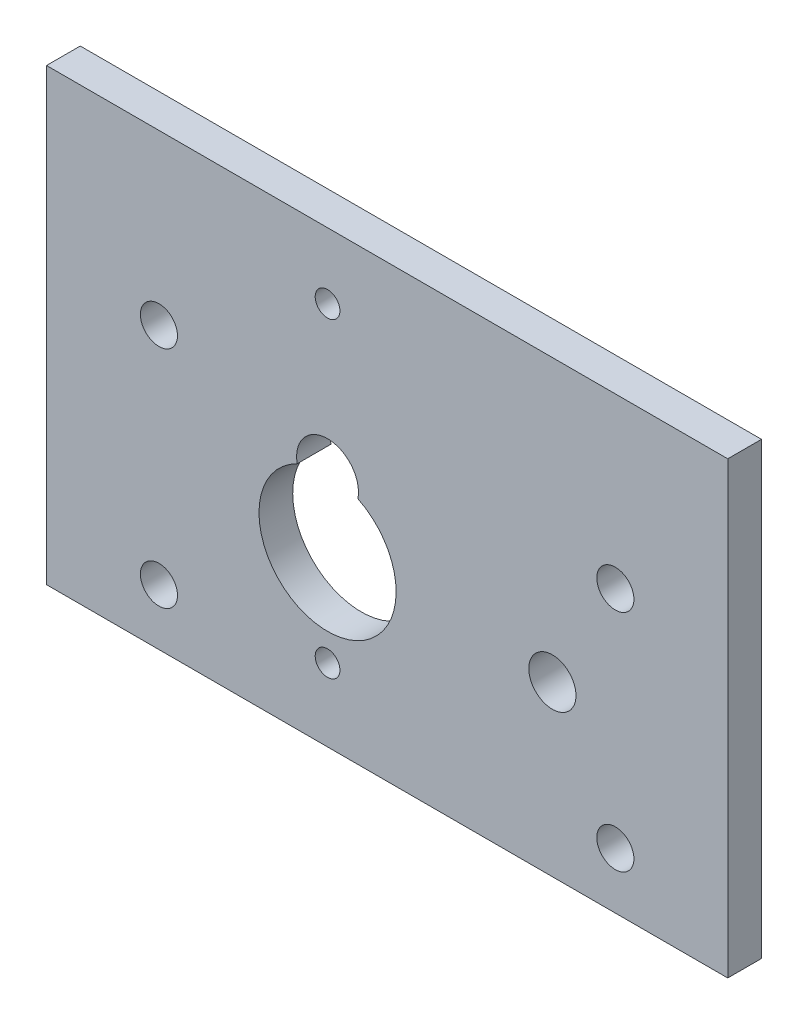
ISO-10303-21;
HEADER;
FILE_DESCRIPTION(('STEP AP214'),'2;1');
FILE_NAME('part.step','',(''),(''),'','','');
FILE_SCHEMA(('AUTOMOTIVE_DESIGN { 1 0 10303 214 1 1 1 1 }'));
ENDSEC;
DATA;
#1=APPLICATION_CONTEXT('core data for automotive mechanical design processes');
#2=APPLICATION_PROTOCOL_DEFINITION('international standard','automotive_design',2000,#1);
#3=PRODUCT_CONTEXT('',#1,'mechanical');
#4=PRODUCT('Part','Part','',(#3));
#5=PRODUCT_RELATED_PRODUCT_CATEGORY('part','',(#4));
#6=PRODUCT_DEFINITION_FORMATION('','',#4);
#7=PRODUCT_DEFINITION_CONTEXT('part definition',#1,'design');
#8=PRODUCT_DEFINITION('design','',#6,#7);
#9=PRODUCT_DEFINITION_SHAPE('','',#8);
#10=(LENGTH_UNIT() NAMED_UNIT(*) SI_UNIT(.MILLI.,.METRE.));
#11=(NAMED_UNIT(*) PLANE_ANGLE_UNIT() SI_UNIT($,.RADIAN.));
#12=(NAMED_UNIT(*) SI_UNIT($,.STERADIAN.) SOLID_ANGLE_UNIT());
#13=UNCERTAINTY_MEASURE_WITH_UNIT(LENGTH_MEASURE(1.E-05),#10,'distance_accuracy_value','');
#14=(GEOMETRIC_REPRESENTATION_CONTEXT(3) GLOBAL_UNCERTAINTY_ASSIGNED_CONTEXT((#13)) GLOBAL_UNIT_ASSIGNED_CONTEXT((#10,
#11,#12)) REPRESENTATION_CONTEXT('',''));
#15=CARTESIAN_POINT('',(0.,0.,0.));
#16=DIRECTION('',(0.,0.,1.));
#17=DIRECTION('',(1.,0.,0.));
#18=AXIS2_PLACEMENT_3D('',#15,#16,#17);
#19=CARTESIAN_POINT('',(0.,0.,3.));
#20=DIRECTION('',(1.,0.,0.));
#21=DIRECTION('',(0.,0.,-1.));
#22=AXIS2_PLACEMENT_3D('',#19,#20,#21);
#23=PLANE('',#22);
#24=DIRECTION('',(0.,-1.,0.));
#25=VECTOR('',#24,1.);
#26=CARTESIAN_POINT('',(0.,0.,0.));
#27=LINE('',#26,#25);
#28=CARTESIAN_POINT('',(0.,40.,0.));
#29=VERTEX_POINT('',#28);
#30=CARTESIAN_POINT('',(0.,0.,0.));
#31=VERTEX_POINT('',#30);
#32=EDGE_CURVE('E113',#29,#31,#27,.T.);
#33=ORIENTED_EDGE('',*,*,#32,.T.);
#34=DIRECTION('',(0.,0.,-1.));
#35=VECTOR('',#34,1.);
#36=CARTESIAN_POINT('',(0.,0.,3.));
#37=LINE('',#36,#35);
#38=CARTESIAN_POINT('',(0.,0.,3.));
#39=VERTEX_POINT('',#38);
#40=EDGE_CURVE('E11',#39,#31,#37,.T.);
#41=ORIENTED_EDGE('',*,*,#40,.F.);
#42=DIRECTION('',(0.,-1.,0.));
#43=VECTOR('',#42,1.);
#44=CARTESIAN_POINT('',(0.,0.,3.));
#45=LINE('',#44,#43);
#46=CARTESIAN_POINT('',(0.,40.,3.));
#47=VERTEX_POINT('',#46);
#48=EDGE_CURVE('E115',#47,#39,#45,.T.);
#49=ORIENTED_EDGE('',*,*,#48,.F.);
#50=DIRECTION('',(0.,0.,-1.));
#51=VECTOR('',#50,1.);
#52=CARTESIAN_POINT('',(0.,40.,3.));
#53=LINE('',#52,#51);
#54=EDGE_CURVE('E125',#47,#29,#53,.T.);
#55=ORIENTED_EDGE('',*,*,#54,.T.);
#56=EDGE_LOOP('',(#33,#41,#49,#55));
#57=FACE_BOUND('',#56,.T.);
#58=ADVANCED_FACE('F39',(#57),#23,.F.);
#59=CARTESIAN_POINT('',(0.,0.,3.));
#60=DIRECTION('',(0.,1.,0.));
#61=DIRECTION('',(0.,0.,1.));
#62=AXIS2_PLACEMENT_3D('',#59,#60,#61);
#63=PLANE('',#62);
#64=DIRECTION('',(1.,0.,0.));
#65=VECTOR('',#64,1.);
#66=CARTESIAN_POINT('',(0.,0.,0.));
#67=LINE('',#66,#65);
#68=CARTESIAN_POINT('',(60.6,0.,0.));
#69=VERTEX_POINT('',#68);
#70=EDGE_CURVE('E128',#31,#69,#67,.T.);
#71=ORIENTED_EDGE('',*,*,#70,.T.);
#72=DIRECTION('',(0.,0.,-1.));
#73=VECTOR('',#72,1.);
#74=CARTESIAN_POINT('',(60.6,0.,3.));
#75=LINE('',#74,#73);
#76=CARTESIAN_POINT('',(60.6,0.,3.));
#77=VERTEX_POINT('',#76);
#78=EDGE_CURVE('E47',#77,#69,#75,.T.);
#79=ORIENTED_EDGE('',*,*,#78,.F.);
#80=DIRECTION('',(1.,0.,0.));
#81=VECTOR('',#80,1.);
#82=CARTESIAN_POINT('',(0.,0.,3.));
#83=LINE('',#82,#81);
#84=EDGE_CURVE('E118',#39,#77,#83,.T.);
#85=ORIENTED_EDGE('',*,*,#84,.F.);
#86=ORIENTED_EDGE('',*,*,#40,.T.);
#87=EDGE_LOOP('',(#71,#79,#85,#86));
#88=FACE_BOUND('',#87,.T.);
#89=ADVANCED_FACE('F225',(#88),#63,.F.);
#90=CARTESIAN_POINT('',(60.6,0.,3.));
#91=DIRECTION('',(-1.,0.,0.));
#92=DIRECTION('',(0.,0.,1.));
#93=AXIS2_PLACEMENT_3D('',#90,#91,#92);
#94=PLANE('',#93);
#95=DIRECTION('',(0.,1.,0.));
#96=VECTOR('',#95,1.);
#97=CARTESIAN_POINT('',(60.6,0.,0.));
#98=LINE('',#97,#96);
#99=CARTESIAN_POINT('',(60.6,40.,0.));
#100=VERTEX_POINT('',#99);
#101=EDGE_CURVE('E130',#69,#100,#98,.T.);
#102=ORIENTED_EDGE('',*,*,#101,.T.);
#103=DIRECTION('',(0.,0.,-1.));
#104=VECTOR('',#103,1.);
#105=CARTESIAN_POINT('',(60.6,40.,3.));
#106=LINE('',#105,#104);
#107=CARTESIAN_POINT('',(60.6,40.,3.));
#108=VERTEX_POINT('',#107);
#109=EDGE_CURVE('E135',#108,#100,#106,.T.);
#110=ORIENTED_EDGE('',*,*,#109,.F.);
#111=DIRECTION('',(0.,1.,0.));
#112=VECTOR('',#111,1.);
#113=CARTESIAN_POINT('',(60.6,0.,3.));
#114=LINE('',#113,#112);
#115=EDGE_CURVE('E121',#77,#108,#114,.T.);
#116=ORIENTED_EDGE('',*,*,#115,.F.);
#117=ORIENTED_EDGE('',*,*,#78,.T.);
#118=EDGE_LOOP('',(#102,#110,#116,#117));
#119=FACE_BOUND('',#118,.T.);
#120=ADVANCED_FACE('F222',(#119),#94,.F.);
#121=CARTESIAN_POINT('',(0.,40.,3.));
#122=DIRECTION('',(0.,-1.,0.));
#123=DIRECTION('',(0.,0.,-1.));
#124=AXIS2_PLACEMENT_3D('',#121,#122,#123);
#125=PLANE('',#124);
#126=DIRECTION('',(-1.,0.,0.));
#127=VECTOR('',#126,1.);
#128=CARTESIAN_POINT('',(0.,40.,0.));
#129=LINE('',#128,#127);
#130=EDGE_CURVE('E119',#100,#29,#129,.T.);
#131=ORIENTED_EDGE('',*,*,#130,.T.);
#132=ORIENTED_EDGE('',*,*,#54,.F.);
#133=DIRECTION('',(-1.,0.,0.));
#134=VECTOR('',#133,1.);
#135=CARTESIAN_POINT('',(0.,40.,3.));
#136=LINE('',#135,#134);
#137=EDGE_CURVE('E123',#108,#47,#136,.T.);
#138=ORIENTED_EDGE('',*,*,#137,.F.);
#139=ORIENTED_EDGE('',*,*,#109,.T.);
#140=EDGE_LOOP('',(#131,#132,#138,#139));
#141=FACE_BOUND('',#140,.T.);
#142=ADVANCED_FACE('F189',(#141),#125,.F.);
#143=CARTESIAN_POINT('',(0.,0.,3.));
#144=DIRECTION('',(0.,0.,-1.));
#145=DIRECTION('',(-1.,0.,0.));
#146=AXIS2_PLACEMENT_3D('',#143,#144,#145);
#147=PLANE('',#146);
#148=CARTESIAN_POINT('',(10.,5.,3.));
#149=DIRECTION('',(0.,0.,1.));
#150=DIRECTION('',(1.,0.,0.));
#151=AXIS2_PLACEMENT_3D('',#148,#149,#150);
#152=CIRCLE('',#151,1.65);
#153=CARTESIAN_POINT('',(11.65,5.,3.));
#154=VERTEX_POINT('',#153);
#155=EDGE_CURVE('E175',#154,#154,#152,.T.);
#156=ORIENTED_EDGE('',*,*,#155,.F.);
#157=EDGE_LOOP('',(#156));
#158=FACE_BOUND('',#157,.T.);
#159=CARTESIAN_POINT('',(10.,25.,3.));
#160=DIRECTION('',(0.,0.,1.));
#161=DIRECTION('',(1.,0.,0.));
#162=AXIS2_PLACEMENT_3D('',#159,#160,#161);
#163=CIRCLE('',#162,1.65);
#164=CARTESIAN_POINT('',(11.65,25.,3.));
#165=VERTEX_POINT('',#164);
#166=EDGE_CURVE('E178',#165,#165,#163,.T.);
#167=ORIENTED_EDGE('',*,*,#166,.F.);
#168=EDGE_LOOP('',(#167));
#169=FACE_BOUND('',#168,.T.);
#170=CARTESIAN_POINT('',(50.6,25.,3.));
#171=DIRECTION('',(0.,0.,1.));
#172=DIRECTION('',(1.,0.,0.));
#173=AXIS2_PLACEMENT_3D('',#170,#171,#172);
#174=CIRCLE('',#173,1.65);
#175=CARTESIAN_POINT('',(52.25,25.,3.));
#176=VERTEX_POINT('',#175);
#177=EDGE_CURVE('E174',#176,#176,#174,.T.);
#178=ORIENTED_EDGE('',*,*,#177,.F.);
#179=EDGE_LOOP('',(#178));
#180=FACE_BOUND('',#179,.T.);
#181=CARTESIAN_POINT('',(50.6,5.,3.));
#182=DIRECTION('',(0.,0.,1.));
#183=DIRECTION('',(1.,0.,0.));
#184=AXIS2_PLACEMENT_3D('',#181,#182,#183);
#185=CIRCLE('',#184,1.65);
#186=CARTESIAN_POINT('',(52.25,5.,3.));
#187=VERTEX_POINT('',#186);
#188=EDGE_CURVE('E144',#187,#187,#185,.T.);
#189=ORIENTED_EDGE('',*,*,#188,.F.);
#190=EDGE_LOOP('',(#189));
#191=FACE_BOUND('',#190,.T.);
#192=CARTESIAN_POINT('',(45.,15.,3.));
#193=DIRECTION('',(0.,0.,-1.));
#194=DIRECTION('',(-1.,0.,0.));
#195=AXIS2_PLACEMENT_3D('',#192,#193,#194);
#196=CIRCLE('',#195,2.1);
#197=CARTESIAN_POINT('',(42.9,15.,3.));
#198=VERTEX_POINT('',#197);
#199=EDGE_CURVE('E108',#198,#198,#196,.T.);
#200=ORIENTED_EDGE('',*,*,#199,.T.);
#201=EDGE_LOOP('',(#200));
#202=FACE_BOUND('',#201,.T.);
#203=CARTESIAN_POINT('',(25.,34.14,3.));
#204=DIRECTION('',(0.,0.,-1.));
#205=DIRECTION('',(-1.,0.,0.));
#206=AXIS2_PLACEMENT_3D('',#203,#204,#205);
#207=CIRCLE('',#206,1.09999999999999);
#208=CARTESIAN_POINT('',(23.9,34.14,3.));
#209=VERTEX_POINT('',#208);
#210=EDGE_CURVE('E158',#209,#209,#207,.T.);
#211=ORIENTED_EDGE('',*,*,#210,.T.);
#212=EDGE_LOOP('',(#211));
#213=FACE_BOUND('',#212,.T.);
#214=CARTESIAN_POINT('',(25.,6.46,3.));
#215=DIRECTION('',(0.,0.,-1.));
#216=DIRECTION('',(-1.,0.,0.));
#217=AXIS2_PLACEMENT_3D('',#214,#215,#216);
#218=CIRCLE('',#217,1.1);
#219=CARTESIAN_POINT('',(23.9,6.46,3.));
#220=VERTEX_POINT('',#219);
#221=EDGE_CURVE('E167',#220,#220,#218,.T.);
#222=ORIENTED_EDGE('',*,*,#221,.T.);
#223=EDGE_LOOP('',(#222));
#224=FACE_BOUND('',#223,.T.);
#225=CARTESIAN_POINT('',(25.,21.,3.));
#226=DIRECTION('',(0.,0.,-1.));
#227=DIRECTION('',(-1.,0.,0.));
#228=AXIS2_PLACEMENT_3D('',#225,#226,#227);
#229=CIRCLE('',#228,2.75);
#230=CARTESIAN_POINT('',(22.3014333231556,20.470625,3.));
#231=VERTEX_POINT('',#230);
#232=CARTESIAN_POINT('',(27.6985666768444,20.470625,3.));
#233=VERTEX_POINT('',#232);
#234=EDGE_CURVE('E96',#231,#233,#229,.T.);
#235=ORIENTED_EDGE('',*,*,#234,.T.);
#236=CARTESIAN_POINT('',(25.,15.,3.));
#237=DIRECTION('',(0.,0.,-1.));
#238=DIRECTION('',(-1.,0.,0.));
#239=AXIS2_PLACEMENT_3D('',#236,#237,#238);
#240=CIRCLE('',#239,6.1);
#241=EDGE_CURVE('E55',#233,#231,#240,.T.);
#242=ORIENTED_EDGE('',*,*,#241,.T.);
#243=EDGE_LOOP('',(#235,#242));
#244=FACE_BOUND('',#243,.T.);
#245=ORIENTED_EDGE('',*,*,#48,.T.);
#246=ORIENTED_EDGE('',*,*,#84,.T.);
#247=ORIENTED_EDGE('',*,*,#115,.T.);
#248=ORIENTED_EDGE('',*,*,#137,.T.);
#249=EDGE_LOOP('',(#245,#246,#247,#248));
#250=FACE_BOUND('',#249,.T.);
#251=ADVANCED_FACE('F102',(#158,#169,#180,#191,#202,#213,#224,#244,#250),#147,.F.);
#252=CARTESIAN_POINT('',(0.,0.,0.));
#253=DIRECTION('',(0.,0.,-1.));
#254=DIRECTION('',(-1.,0.,0.));
#255=AXIS2_PLACEMENT_3D('',#252,#253,#254);
#256=PLANE('',#255);
#257=CARTESIAN_POINT('',(10.,5.,0.));
#258=DIRECTION('',(0.,0.,-1.));
#259=DIRECTION('',(-1.,0.,0.));
#260=AXIS2_PLACEMENT_3D('',#257,#258,#259);
#261=CIRCLE('',#260,1.65);
#262=CARTESIAN_POINT('',(11.65,5.,0.));
#263=VERTEX_POINT('',#262);
#264=EDGE_CURVE('E42',#263,#263,#261,.T.);
#265=ORIENTED_EDGE('',*,*,#264,.F.);
#266=EDGE_LOOP('',(#265));
#267=FACE_BOUND('',#266,.T.);
#268=CARTESIAN_POINT('',(10.,25.,0.));
#269=DIRECTION('',(0.,0.,-1.));
#270=DIRECTION('',(-1.,0.,0.));
#271=AXIS2_PLACEMENT_3D('',#268,#269,#270);
#272=CIRCLE('',#271,1.65);
#273=CARTESIAN_POINT('',(11.65,25.,0.));
#274=VERTEX_POINT('',#273);
#275=EDGE_CURVE('E146',#274,#274,#272,.T.);
#276=ORIENTED_EDGE('',*,*,#275,.F.);
#277=EDGE_LOOP('',(#276));
#278=FACE_BOUND('',#277,.T.);
#279=CARTESIAN_POINT('',(50.6,25.,0.));
#280=DIRECTION('',(0.,0.,-1.));
#281=DIRECTION('',(-1.,0.,0.));
#282=AXIS2_PLACEMENT_3D('',#279,#280,#281);
#283=CIRCLE('',#282,1.65);
#284=CARTESIAN_POINT('',(52.25,25.,0.));
#285=VERTEX_POINT('',#284);
#286=EDGE_CURVE('E143',#285,#285,#283,.T.);
#287=ORIENTED_EDGE('',*,*,#286,.F.);
#288=EDGE_LOOP('',(#287));
#289=FACE_BOUND('',#288,.T.);
#290=CARTESIAN_POINT('',(50.6,5.,0.));
#291=DIRECTION('',(0.,0.,-1.));
#292=DIRECTION('',(-1.,0.,0.));
#293=AXIS2_PLACEMENT_3D('',#290,#291,#292);
#294=CIRCLE('',#293,1.65);
#295=CARTESIAN_POINT('',(52.25,5.,0.));
#296=VERTEX_POINT('',#295);
#297=EDGE_CURVE('E140',#296,#296,#294,.T.);
#298=ORIENTED_EDGE('',*,*,#297,.F.);
#299=EDGE_LOOP('',(#298));
#300=FACE_BOUND('',#299,.T.);
#301=CARTESIAN_POINT('',(45.,15.,0.));
#302=DIRECTION('',(0.,0.,-1.));
#303=DIRECTION('',(-1.,0.,0.));
#304=AXIS2_PLACEMENT_3D('',#301,#302,#303);
#305=CIRCLE('',#304,2.1);
#306=CARTESIAN_POINT('',(42.9,15.,0.));
#307=VERTEX_POINT('',#306);
#308=EDGE_CURVE('E154',#307,#307,#305,.T.);
#309=ORIENTED_EDGE('',*,*,#308,.F.);
#310=EDGE_LOOP('',(#309));
#311=FACE_BOUND('',#310,.T.);
#312=CARTESIAN_POINT('',(25.,34.14,0.));
#313=DIRECTION('',(0.,0.,-1.));
#314=DIRECTION('',(-1.,0.,0.));
#315=AXIS2_PLACEMENT_3D('',#312,#313,#314);
#316=CIRCLE('',#315,1.09999999999999);
#317=CARTESIAN_POINT('',(23.9,34.14,0.));
#318=VERTEX_POINT('',#317);
#319=EDGE_CURVE('E162',#318,#318,#316,.T.);
#320=ORIENTED_EDGE('',*,*,#319,.F.);
#321=EDGE_LOOP('',(#320));
#322=FACE_BOUND('',#321,.T.);
#323=CARTESIAN_POINT('',(25.,6.46,0.));
#324=DIRECTION('',(0.,0.,-1.));
#325=DIRECTION('',(-1.,0.,0.));
#326=AXIS2_PLACEMENT_3D('',#323,#324,#325);
#327=CIRCLE('',#326,1.1);
#328=CARTESIAN_POINT('',(23.9,6.46,0.));
#329=VERTEX_POINT('',#328);
#330=EDGE_CURVE('E111',#329,#329,#327,.T.);
#331=ORIENTED_EDGE('',*,*,#330,.F.);
#332=EDGE_LOOP('',(#331));
#333=FACE_BOUND('',#332,.T.);
#334=CARTESIAN_POINT('',(25.,15.,0.));
#335=DIRECTION('',(0.,0.,-1.));
#336=DIRECTION('',(-1.,0.,0.));
#337=AXIS2_PLACEMENT_3D('',#334,#335,#336);
#338=CIRCLE('',#337,6.1);
#339=CARTESIAN_POINT('',(27.6985666768444,20.470625,0.));
#340=VERTEX_POINT('',#339);
#341=CARTESIAN_POINT('',(22.3014333231556,20.470625,0.));
#342=VERTEX_POINT('',#341);
#343=EDGE_CURVE('E60',#340,#342,#338,.T.);
#344=ORIENTED_EDGE('',*,*,#343,.F.);
#345=CARTESIAN_POINT('',(25.,21.,0.));
#346=DIRECTION('',(0.,0.,-1.));
#347=DIRECTION('',(-1.,0.,0.));
#348=AXIS2_PLACEMENT_3D('',#345,#346,#347);
#349=CIRCLE('',#348,2.75);
#350=EDGE_CURVE('E104',#342,#340,#349,.T.);
#351=ORIENTED_EDGE('',*,*,#350,.F.);
#352=EDGE_LOOP('',(#344,#351));
#353=FACE_BOUND('',#352,.T.);
#354=ORIENTED_EDGE('',*,*,#32,.F.);
#355=ORIENTED_EDGE('',*,*,#130,.F.);
#356=ORIENTED_EDGE('',*,*,#101,.F.);
#357=ORIENTED_EDGE('',*,*,#70,.F.);
#358=EDGE_LOOP('',(#354,#355,#356,#357));
#359=FACE_BOUND('',#358,.T.);
#360=ADVANCED_FACE('F188',(#267,#278,#289,#300,#311,#322,#333,#353,#359),#256,.T.);
#361=CARTESIAN_POINT('',(25.,15.,3.));
#362=DIRECTION('',(0.,0.,-1.));
#363=DIRECTION('',(-1.,0.,0.));
#364=AXIS2_PLACEMENT_3D('',#361,#362,#363);
#365=CYLINDRICAL_SURFACE('',#364,6.1);
#366=ORIENTED_EDGE('',*,*,#343,.T.);
#367=DIRECTION('',(0.,0.,-1.));
#368=VECTOR('',#367,1.);
#369=CARTESIAN_POINT('',(22.3014333231556,20.470625,3.));
#370=LINE('',#369,#368);
#371=EDGE_CURVE('E89',#231,#342,#370,.T.);
#372=ORIENTED_EDGE('',*,*,#371,.F.);
#373=ORIENTED_EDGE('',*,*,#241,.F.);
#374=DIRECTION('',(0.,0.,-1.));
#375=VECTOR('',#374,1.);
#376=CARTESIAN_POINT('',(27.6985666768444,20.470625,3.));
#377=LINE('',#376,#375);
#378=EDGE_CURVE('E95',#233,#340,#377,.T.);
#379=ORIENTED_EDGE('',*,*,#378,.T.);
#380=EDGE_LOOP('',(#366,#372,#373,#379));
#381=FACE_BOUND('',#380,.T.);
#382=ADVANCED_FACE('F91',(#381),#365,.F.);
#383=CARTESIAN_POINT('',(25.,21.,3.));
#384=DIRECTION('',(0.,0.,-1.));
#385=DIRECTION('',(-1.,0.,0.));
#386=AXIS2_PLACEMENT_3D('',#383,#384,#385);
#387=CYLINDRICAL_SURFACE('',#386,2.75);
#388=ORIENTED_EDGE('',*,*,#350,.T.);
#389=ORIENTED_EDGE('',*,*,#378,.F.);
#390=ORIENTED_EDGE('',*,*,#234,.F.);
#391=ORIENTED_EDGE('',*,*,#371,.T.);
#392=EDGE_LOOP('',(#388,#389,#390,#391));
#393=FACE_BOUND('',#392,.T.);
#394=ADVANCED_FACE('F99',(#393),#387,.F.);
#395=CARTESIAN_POINT('',(25.,6.46,3.));
#396=DIRECTION('',(0.,0.,-1.));
#397=DIRECTION('',(-1.,0.,0.));
#398=AXIS2_PLACEMENT_3D('',#395,#396,#397);
#399=CYLINDRICAL_SURFACE('',#398,1.1);
#400=ORIENTED_EDGE('',*,*,#221,.F.);
#401=EDGE_LOOP('',(#400));
#402=FACE_BOUND('',#401,.T.);
#403=ORIENTED_EDGE('',*,*,#330,.T.);
#404=EDGE_LOOP('',(#403));
#405=FACE_BOUND('',#404,.T.);
#406=ADVANCED_FACE('F198',(#402,#405),#399,.F.);
#407=CARTESIAN_POINT('',(25.,34.14,3.));
#408=DIRECTION('',(0.,0.,-1.));
#409=DIRECTION('',(-1.,0.,0.));
#410=AXIS2_PLACEMENT_3D('',#407,#408,#409);
#411=CYLINDRICAL_SURFACE('',#410,1.09999999999999);
#412=ORIENTED_EDGE('',*,*,#210,.F.);
#413=EDGE_LOOP('',(#412));
#414=FACE_BOUND('',#413,.T.);
#415=ORIENTED_EDGE('',*,*,#319,.T.);
#416=EDGE_LOOP('',(#415));
#417=FACE_BOUND('',#416,.T.);
#418=ADVANCED_FACE('F201',(#414,#417),#411,.F.);
#419=CARTESIAN_POINT('',(45.,15.,3.));
#420=DIRECTION('',(0.,0.,-1.));
#421=DIRECTION('',(-1.,0.,0.));
#422=AXIS2_PLACEMENT_3D('',#419,#420,#421);
#423=CYLINDRICAL_SURFACE('',#422,2.1);
#424=ORIENTED_EDGE('',*,*,#199,.F.);
#425=EDGE_LOOP('',(#424));
#426=FACE_BOUND('',#425,.T.);
#427=ORIENTED_EDGE('',*,*,#308,.T.);
#428=EDGE_LOOP('',(#427));
#429=FACE_BOUND('',#428,.T.);
#430=ADVANCED_FACE('F239',(#426,#429),#423,.F.);
#431=CARTESIAN_POINT('',(50.6,5.,-10.));
#432=DIRECTION('',(0.,0.,1.));
#433=DIRECTION('',(1.,0.,0.));
#434=AXIS2_PLACEMENT_3D('',#431,#432,#433);
#435=CYLINDRICAL_SURFACE('',#434,1.65);
#436=CARTESIAN_POINT('',(52.25,5.,0.));
#437=CARTESIAN_POINT('',(52.25,5.,0.0312500000000018));
#438=CARTESIAN_POINT('',(52.25,5.,0.0625000000000018));
#439=CARTESIAN_POINT('',(52.25,5.,0.125000000000002));
#440=CARTESIAN_POINT('',(52.25,5.,0.156250000000002));
#441=CARTESIAN_POINT('',(52.25,5.,0.218750000000002));
#442=CARTESIAN_POINT('',(52.25,5.,0.250000000000002));
#443=CARTESIAN_POINT('',(52.25,5.,0.312500000000002));
#444=CARTESIAN_POINT('',(52.25,5.,0.343750000000002));
#445=CARTESIAN_POINT('',(52.25,5.,0.406250000000002));
#446=CARTESIAN_POINT('',(52.25,5.,0.437500000000002));
#447=CARTESIAN_POINT('',(52.25,5.,0.500000000000002));
#448=CARTESIAN_POINT('',(52.25,5.,0.531250000000002));
#449=CARTESIAN_POINT('',(52.25,5.,0.593750000000002));
#450=CARTESIAN_POINT('',(52.25,5.,0.625000000000002));
#451=CARTESIAN_POINT('',(52.25,5.,0.687500000000002));
#452=CARTESIAN_POINT('',(52.25,5.,0.718750000000002));
#453=CARTESIAN_POINT('',(52.25,5.,0.781250000000002));
#454=CARTESIAN_POINT('',(52.25,5.,0.812500000000001));
#455=CARTESIAN_POINT('',(52.25,5.,0.875000000000001));
#456=CARTESIAN_POINT('',(52.25,5.,0.906250000000001));
#457=CARTESIAN_POINT('',(52.25,5.,0.968750000000001));
#458=CARTESIAN_POINT('',(52.25,5.,1.));
#459=CARTESIAN_POINT('',(52.25,5.,1.0625));
#460=CARTESIAN_POINT('',(52.25,5.,1.09375));
#461=CARTESIAN_POINT('',(52.25,5.,1.15625));
#462=CARTESIAN_POINT('',(52.25,5.,1.1875));
#463=CARTESIAN_POINT('',(52.25,5.,1.25));
#464=CARTESIAN_POINT('',(52.25,5.,1.28125));
#465=CARTESIAN_POINT('',(52.25,5.,1.34375));
#466=CARTESIAN_POINT('',(52.25,5.,1.375));
#467=CARTESIAN_POINT('',(52.25,5.,1.4375));
#468=CARTESIAN_POINT('',(52.25,5.,1.46875));
#469=CARTESIAN_POINT('',(52.25,5.,1.53125));
#470=CARTESIAN_POINT('',(52.25,5.,1.5625));
#471=CARTESIAN_POINT('',(52.25,5.,1.625));
#472=CARTESIAN_POINT('',(52.25,5.,1.65625));
#473=CARTESIAN_POINT('',(52.25,5.,1.71875));
#474=CARTESIAN_POINT('',(52.25,5.,1.75));
#475=CARTESIAN_POINT('',(52.25,5.,1.8125));
#476=CARTESIAN_POINT('',(52.25,5.,1.84375));
#477=CARTESIAN_POINT('',(52.25,5.,1.90625));
#478=CARTESIAN_POINT('',(52.25,5.,1.9375));
#479=CARTESIAN_POINT('',(52.25,5.,2.));
#480=CARTESIAN_POINT('',(52.25,5.,2.03125));
#481=CARTESIAN_POINT('',(52.25,5.,2.09375));
#482=CARTESIAN_POINT('',(52.25,5.,2.125));
#483=CARTESIAN_POINT('',(52.25,5.,2.1875));
#484=CARTESIAN_POINT('',(52.25,5.,2.21875));
#485=CARTESIAN_POINT('',(52.25,5.,2.28125));
#486=CARTESIAN_POINT('',(52.25,5.,2.3125));
#487=CARTESIAN_POINT('',(52.25,5.,2.375));
#488=CARTESIAN_POINT('',(52.25,5.,2.40625));
#489=CARTESIAN_POINT('',(52.25,5.,2.46875));
#490=CARTESIAN_POINT('',(52.25,5.,2.5));
#491=CARTESIAN_POINT('',(52.25,5.,2.5625));
#492=CARTESIAN_POINT('',(52.25,5.,2.59375));
#493=CARTESIAN_POINT('',(52.25,5.,2.65625));
#494=CARTESIAN_POINT('',(52.25,5.,2.6875));
#495=CARTESIAN_POINT('',(52.25,5.,2.75));
#496=CARTESIAN_POINT('',(52.25,5.,2.78125));
#497=CARTESIAN_POINT('',(52.25,5.,2.84375));
#498=CARTESIAN_POINT('',(52.25,5.,2.875));
#499=CARTESIAN_POINT('',(52.25,5.,2.9375));
#500=CARTESIAN_POINT('',(52.25,5.,2.96875));
#501=CARTESIAN_POINT('',(52.25,5.,3.));
#502=B_SPLINE_CURVE_WITH_KNOTS('',3,(#436,#437,#438,#439,#440,#441,#442,#443,#444,#445,#446,
#447,#448,#449,#450,#451,#452,#453,#454,#455,#456,#457,#458,#459,#460,#461,#462,#463,#464,#465,
#466,#467,#468,#469,#470,#471,#472,#473,#474,#475,#476,#477,#478,#479,#480,#481,#482,#483,#484,
#485,#486,#487,#488,#489,#490,#491,#492,#493,#494,#495,#496,#497,#498,#499,#500,#501),
.UNSPECIFIED.,.F.,.F.,(4,2,2,2,2,2,2,2,2,2,2,2,2,2,2,2,2,2,2,2,2,2,2,2,2,2,2,2,2,2,2,2,4),(0.,
0.0937500000000001,0.1875,0.28125,0.375,0.46875,0.5625,0.656250000000001,0.750000000000001,
0.843749999999999,0.937499999999999,1.03125,1.125,1.21875,1.3125,1.40625,1.5,1.59375,1.6875,
1.78125,1.875,1.96875,2.0625,2.15625,2.25,2.34375,2.4375,2.53125,2.625,2.71875,2.8125,2.90625,
3.),.UNSPECIFIED.);
#503=EDGE_CURVE('BSEAM242',#296,#187,#502,.T.);
#504=ORIENTED_EDGE('',*,*,#297,.T.);
#505=ORIENTED_EDGE('',*,*,#188,.T.);
#506=ORIENTED_EDGE('',*,*,#503,.T.);
#507=ORIENTED_EDGE('',*,*,#503,.F.);
#508=EDGE_LOOP('',(#504,#506,#505,#507));
#509=FACE_BOUND('',#508,.T.);
#510=ADVANCED_FACE('F242',(#509),#435,.F.);
#511=CARTESIAN_POINT('',(50.6,25.,-10.));
#512=DIRECTION('',(0.,0.,1.));
#513=DIRECTION('',(1.,0.,0.));
#514=AXIS2_PLACEMENT_3D('',#511,#512,#513);
#515=CYLINDRICAL_SURFACE('',#514,1.65);
#516=CARTESIAN_POINT('',(52.25,25.,0.));
#517=CARTESIAN_POINT('',(52.25,25.,0.0312500000000018));
#518=CARTESIAN_POINT('',(52.25,25.,0.0625000000000018));
#519=CARTESIAN_POINT('',(52.25,25.,0.125000000000002));
#520=CARTESIAN_POINT('',(52.25,25.,0.156250000000002));
#521=CARTESIAN_POINT('',(52.25,25.,0.218750000000002));
#522=CARTESIAN_POINT('',(52.25,25.,0.250000000000002));
#523=CARTESIAN_POINT('',(52.25,25.,0.312500000000002));
#524=CARTESIAN_POINT('',(52.25,25.,0.343750000000002));
#525=CARTESIAN_POINT('',(52.25,25.,0.406250000000002));
#526=CARTESIAN_POINT('',(52.25,25.,0.437500000000002));
#527=CARTESIAN_POINT('',(52.25,25.,0.500000000000002));
#528=CARTESIAN_POINT('',(52.25,25.,0.531250000000002));
#529=CARTESIAN_POINT('',(52.25,25.,0.593750000000002));
#530=CARTESIAN_POINT('',(52.25,25.,0.625000000000002));
#531=CARTESIAN_POINT('',(52.25,25.,0.687500000000002));
#532=CARTESIAN_POINT('',(52.25,25.,0.718750000000002));
#533=CARTESIAN_POINT('',(52.25,25.,0.781250000000002));
#534=CARTESIAN_POINT('',(52.25,25.,0.812500000000001));
#535=CARTESIAN_POINT('',(52.25,25.,0.875000000000001));
#536=CARTESIAN_POINT('',(52.25,25.,0.906250000000001));
#537=CARTESIAN_POINT('',(52.25,25.,0.968750000000001));
#538=CARTESIAN_POINT('',(52.25,25.,1.));
#539=CARTESIAN_POINT('',(52.25,25.,1.0625));
#540=CARTESIAN_POINT('',(52.25,25.,1.09375));
#541=CARTESIAN_POINT('',(52.25,25.,1.15625));
#542=CARTESIAN_POINT('',(52.25,25.,1.1875));
#543=CARTESIAN_POINT('',(52.25,25.,1.25));
#544=CARTESIAN_POINT('',(52.25,25.,1.28125));
#545=CARTESIAN_POINT('',(52.25,25.,1.34375));
#546=CARTESIAN_POINT('',(52.25,25.,1.375));
#547=CARTESIAN_POINT('',(52.25,25.,1.4375));
#548=CARTESIAN_POINT('',(52.25,25.,1.46875));
#549=CARTESIAN_POINT('',(52.25,25.,1.53125));
#550=CARTESIAN_POINT('',(52.25,25.,1.5625));
#551=CARTESIAN_POINT('',(52.25,25.,1.625));
#552=CARTESIAN_POINT('',(52.25,25.,1.65625));
#553=CARTESIAN_POINT('',(52.25,25.,1.71875));
#554=CARTESIAN_POINT('',(52.25,25.,1.75));
#555=CARTESIAN_POINT('',(52.25,25.,1.8125));
#556=CARTESIAN_POINT('',(52.25,25.,1.84375));
#557=CARTESIAN_POINT('',(52.25,25.,1.90625));
#558=CARTESIAN_POINT('',(52.25,25.,1.9375));
#559=CARTESIAN_POINT('',(52.25,25.,2.));
#560=CARTESIAN_POINT('',(52.25,25.,2.03125));
#561=CARTESIAN_POINT('',(52.25,25.,2.09375));
#562=CARTESIAN_POINT('',(52.25,25.,2.125));
#563=CARTESIAN_POINT('',(52.25,25.,2.1875));
#564=CARTESIAN_POINT('',(52.25,25.,2.21875));
#565=CARTESIAN_POINT('',(52.25,25.,2.28125));
#566=CARTESIAN_POINT('',(52.25,25.,2.3125));
#567=CARTESIAN_POINT('',(52.25,25.,2.375));
#568=CARTESIAN_POINT('',(52.25,25.,2.40625));
#569=CARTESIAN_POINT('',(52.25,25.,2.46875));
#570=CARTESIAN_POINT('',(52.25,25.,2.5));
#571=CARTESIAN_POINT('',(52.25,25.,2.5625));
#572=CARTESIAN_POINT('',(52.25,25.,2.59375));
#573=CARTESIAN_POINT('',(52.25,25.,2.65625));
#574=CARTESIAN_POINT('',(52.25,25.,2.6875));
#575=CARTESIAN_POINT('',(52.25,25.,2.75));
#576=CARTESIAN_POINT('',(52.25,25.,2.78125));
#577=CARTESIAN_POINT('',(52.25,25.,2.84375));
#578=CARTESIAN_POINT('',(52.25,25.,2.875));
#579=CARTESIAN_POINT('',(52.25,25.,2.9375));
#580=CARTESIAN_POINT('',(52.25,25.,2.96875));
#581=CARTESIAN_POINT('',(52.25,25.,3.));
#582=B_SPLINE_CURVE_WITH_KNOTS('',3,(#516,#517,#518,#519,#520,#521,#522,#523,#524,#525,#526,
#527,#528,#529,#530,#531,#532,#533,#534,#535,#536,#537,#538,#539,#540,#541,#542,#543,#544,#545,
#546,#547,#548,#549,#550,#551,#552,#553,#554,#555,#556,#557,#558,#559,#560,#561,#562,#563,#564,
#565,#566,#567,#568,#569,#570,#571,#572,#573,#574,#575,#576,#577,#578,#579,#580,#581),
.UNSPECIFIED.,.F.,.F.,(4,2,2,2,2,2,2,2,2,2,2,2,2,2,2,2,2,2,2,2,2,2,2,2,2,2,2,2,2,2,2,2,4),(0.,
0.0937500000000001,0.1875,0.28125,0.375,0.46875,0.5625,0.656250000000001,0.750000000000001,
0.843749999999999,0.937499999999999,1.03125,1.125,1.21875,1.3125,1.40625,1.5,1.59375,1.6875,
1.78125,1.875,1.96875,2.0625,2.15625,2.25,2.34375,2.4375,2.53125,2.625,2.71875,2.8125,2.90625,
3.),.UNSPECIFIED.);
#583=EDGE_CURVE('BSEAM184',#285,#176,#582,.T.);
#584=ORIENTED_EDGE('',*,*,#286,.T.);
#585=ORIENTED_EDGE('',*,*,#177,.T.);
#586=ORIENTED_EDGE('',*,*,#583,.T.);
#587=ORIENTED_EDGE('',*,*,#583,.F.);
#588=EDGE_LOOP('',(#584,#586,#585,#587));
#589=FACE_BOUND('',#588,.T.);
#590=ADVANCED_FACE('F184',(#589),#515,.F.);
#591=CARTESIAN_POINT('',(10.,25.,-10.));
#592=DIRECTION('',(0.,0.,1.));
#593=DIRECTION('',(1.,0.,0.));
#594=AXIS2_PLACEMENT_3D('',#591,#592,#593);
#595=CYLINDRICAL_SURFACE('',#594,1.65);
#596=CARTESIAN_POINT('',(11.65,25.,0.));
#597=CARTESIAN_POINT('',(11.65,25.,0.0312500000000018));
#598=CARTESIAN_POINT('',(11.65,25.,0.0625000000000018));
#599=CARTESIAN_POINT('',(11.65,25.,0.125000000000002));
#600=CARTESIAN_POINT('',(11.65,25.,0.156250000000002));
#601=CARTESIAN_POINT('',(11.65,25.,0.218750000000002));
#602=CARTESIAN_POINT('',(11.65,25.,0.250000000000002));
#603=CARTESIAN_POINT('',(11.65,25.,0.312500000000002));
#604=CARTESIAN_POINT('',(11.65,25.,0.343750000000002));
#605=CARTESIAN_POINT('',(11.65,25.,0.406250000000002));
#606=CARTESIAN_POINT('',(11.65,25.,0.437500000000002));
#607=CARTESIAN_POINT('',(11.65,25.,0.500000000000002));
#608=CARTESIAN_POINT('',(11.65,25.,0.531250000000002));
#609=CARTESIAN_POINT('',(11.65,25.,0.593750000000002));
#610=CARTESIAN_POINT('',(11.65,25.,0.625000000000002));
#611=CARTESIAN_POINT('',(11.65,25.,0.687500000000002));
#612=CARTESIAN_POINT('',(11.65,25.,0.718750000000002));
#613=CARTESIAN_POINT('',(11.65,25.,0.781250000000002));
#614=CARTESIAN_POINT('',(11.65,25.,0.812500000000001));
#615=CARTESIAN_POINT('',(11.65,25.,0.875000000000001));
#616=CARTESIAN_POINT('',(11.65,25.,0.906250000000001));
#617=CARTESIAN_POINT('',(11.65,25.,0.968750000000001));
#618=CARTESIAN_POINT('',(11.65,25.,1.));
#619=CARTESIAN_POINT('',(11.65,25.,1.0625));
#620=CARTESIAN_POINT('',(11.65,25.,1.09375));
#621=CARTESIAN_POINT('',(11.65,25.,1.15625));
#622=CARTESIAN_POINT('',(11.65,25.,1.1875));
#623=CARTESIAN_POINT('',(11.65,25.,1.25));
#624=CARTESIAN_POINT('',(11.65,25.,1.28125));
#625=CARTESIAN_POINT('',(11.65,25.,1.34375));
#626=CARTESIAN_POINT('',(11.65,25.,1.375));
#627=CARTESIAN_POINT('',(11.65,25.,1.4375));
#628=CARTESIAN_POINT('',(11.65,25.,1.46875));
#629=CARTESIAN_POINT('',(11.65,25.,1.53125));
#630=CARTESIAN_POINT('',(11.65,25.,1.5625));
#631=CARTESIAN_POINT('',(11.65,25.,1.625));
#632=CARTESIAN_POINT('',(11.65,25.,1.65625));
#633=CARTESIAN_POINT('',(11.65,25.,1.71875));
#634=CARTESIAN_POINT('',(11.65,25.,1.75));
#635=CARTESIAN_POINT('',(11.65,25.,1.8125));
#636=CARTESIAN_POINT('',(11.65,25.,1.84375));
#637=CARTESIAN_POINT('',(11.65,25.,1.90625));
#638=CARTESIAN_POINT('',(11.65,25.,1.9375));
#639=CARTESIAN_POINT('',(11.65,25.,2.));
#640=CARTESIAN_POINT('',(11.65,25.,2.03125));
#641=CARTESIAN_POINT('',(11.65,25.,2.09375));
#642=CARTESIAN_POINT('',(11.65,25.,2.125));
#643=CARTESIAN_POINT('',(11.65,25.,2.1875));
#644=CARTESIAN_POINT('',(11.65,25.,2.21875));
#645=CARTESIAN_POINT('',(11.65,25.,2.28125));
#646=CARTESIAN_POINT('',(11.65,25.,2.3125));
#647=CARTESIAN_POINT('',(11.65,25.,2.375));
#648=CARTESIAN_POINT('',(11.65,25.,2.40625));
#649=CARTESIAN_POINT('',(11.65,25.,2.46875));
#650=CARTESIAN_POINT('',(11.65,25.,2.5));
#651=CARTESIAN_POINT('',(11.65,25.,2.5625));
#652=CARTESIAN_POINT('',(11.65,25.,2.59375));
#653=CARTESIAN_POINT('',(11.65,25.,2.65625));
#654=CARTESIAN_POINT('',(11.65,25.,2.6875));
#655=CARTESIAN_POINT('',(11.65,25.,2.75));
#656=CARTESIAN_POINT('',(11.65,25.,2.78125));
#657=CARTESIAN_POINT('',(11.65,25.,2.84375));
#658=CARTESIAN_POINT('',(11.65,25.,2.875));
#659=CARTESIAN_POINT('',(11.65,25.,2.9375));
#660=CARTESIAN_POINT('',(11.65,25.,2.96875));
#661=CARTESIAN_POINT('',(11.65,25.,3.));
#662=B_SPLINE_CURVE_WITH_KNOTS('',3,(#596,#597,#598,#599,#600,#601,#602,#603,#604,#605,#606,
#607,#608,#609,#610,#611,#612,#613,#614,#615,#616,#617,#618,#619,#620,#621,#622,#623,#624,#625,
#626,#627,#628,#629,#630,#631,#632,#633,#634,#635,#636,#637,#638,#639,#640,#641,#642,#643,#644,
#645,#646,#647,#648,#649,#650,#651,#652,#653,#654,#655,#656,#657,#658,#659,#660,#661),
.UNSPECIFIED.,.F.,.F.,(4,2,2,2,2,2,2,2,2,2,2,2,2,2,2,2,2,2,2,2,2,2,2,2,2,2,2,2,2,2,2,2,4),(0.,
0.0937500000000001,0.1875,0.28125,0.375,0.46875,0.5625,0.656250000000001,0.750000000000001,
0.843749999999999,0.937499999999999,1.03125,1.125,1.21875,1.3125,1.40625,1.5,1.59375,1.6875,
1.78125,1.875,1.96875,2.0625,2.15625,2.25,2.34375,2.4375,2.53125,2.625,2.71875,2.8125,2.90625,
3.),.UNSPECIFIED.);
#663=EDGE_CURVE('BSEAM253',#274,#165,#662,.T.);
#664=ORIENTED_EDGE('',*,*,#275,.T.);
#665=ORIENTED_EDGE('',*,*,#166,.T.);
#666=ORIENTED_EDGE('',*,*,#663,.T.);
#667=ORIENTED_EDGE('',*,*,#663,.F.);
#668=EDGE_LOOP('',(#664,#666,#665,#667));
#669=FACE_BOUND('',#668,.T.);
#670=ADVANCED_FACE('F253',(#669),#595,.F.);
#671=CARTESIAN_POINT('',(10.,5.,-10.));
#672=DIRECTION('',(0.,0.,1.));
#673=DIRECTION('',(1.,0.,0.));
#674=AXIS2_PLACEMENT_3D('',#671,#672,#673);
#675=CYLINDRICAL_SURFACE('',#674,1.65);
#676=CARTESIAN_POINT('',(11.65,5.,0.));
#677=CARTESIAN_POINT('',(11.65,5.,0.0312500000000018));
#678=CARTESIAN_POINT('',(11.65,5.,0.0625000000000018));
#679=CARTESIAN_POINT('',(11.65,5.,0.125000000000002));
#680=CARTESIAN_POINT('',(11.65,5.,0.156250000000002));
#681=CARTESIAN_POINT('',(11.65,5.,0.218750000000002));
#682=CARTESIAN_POINT('',(11.65,5.,0.250000000000002));
#683=CARTESIAN_POINT('',(11.65,5.,0.312500000000002));
#684=CARTESIAN_POINT('',(11.65,5.,0.343750000000002));
#685=CARTESIAN_POINT('',(11.65,5.,0.406250000000002));
#686=CARTESIAN_POINT('',(11.65,5.,0.437500000000002));
#687=CARTESIAN_POINT('',(11.65,5.,0.500000000000002));
#688=CARTESIAN_POINT('',(11.65,5.,0.531250000000002));
#689=CARTESIAN_POINT('',(11.65,5.,0.593750000000002));
#690=CARTESIAN_POINT('',(11.65,5.,0.625000000000002));
#691=CARTESIAN_POINT('',(11.65,5.,0.687500000000002));
#692=CARTESIAN_POINT('',(11.65,5.,0.718750000000002));
#693=CARTESIAN_POINT('',(11.65,5.,0.781250000000002));
#694=CARTESIAN_POINT('',(11.65,5.,0.812500000000001));
#695=CARTESIAN_POINT('',(11.65,5.,0.875000000000001));
#696=CARTESIAN_POINT('',(11.65,5.,0.906250000000001));
#697=CARTESIAN_POINT('',(11.65,5.,0.968750000000001));
#698=CARTESIAN_POINT('',(11.65,5.,1.));
#699=CARTESIAN_POINT('',(11.65,5.,1.0625));
#700=CARTESIAN_POINT('',(11.65,5.,1.09375));
#701=CARTESIAN_POINT('',(11.65,5.,1.15625));
#702=CARTESIAN_POINT('',(11.65,5.,1.1875));
#703=CARTESIAN_POINT('',(11.65,5.,1.25));
#704=CARTESIAN_POINT('',(11.65,5.,1.28125));
#705=CARTESIAN_POINT('',(11.65,5.,1.34375));
#706=CARTESIAN_POINT('',(11.65,5.,1.375));
#707=CARTESIAN_POINT('',(11.65,5.,1.4375));
#708=CARTESIAN_POINT('',(11.65,5.,1.46875));
#709=CARTESIAN_POINT('',(11.65,5.,1.53125));
#710=CARTESIAN_POINT('',(11.65,5.,1.5625));
#711=CARTESIAN_POINT('',(11.65,5.,1.625));
#712=CARTESIAN_POINT('',(11.65,5.,1.65625));
#713=CARTESIAN_POINT('',(11.65,5.,1.71875));
#714=CARTESIAN_POINT('',(11.65,5.,1.75));
#715=CARTESIAN_POINT('',(11.65,5.,1.8125));
#716=CARTESIAN_POINT('',(11.65,5.,1.84375));
#717=CARTESIAN_POINT('',(11.65,5.,1.90625));
#718=CARTESIAN_POINT('',(11.65,5.,1.9375));
#719=CARTESIAN_POINT('',(11.65,5.,2.));
#720=CARTESIAN_POINT('',(11.65,5.,2.03125));
#721=CARTESIAN_POINT('',(11.65,5.,2.09375));
#722=CARTESIAN_POINT('',(11.65,5.,2.125));
#723=CARTESIAN_POINT('',(11.65,5.,2.1875));
#724=CARTESIAN_POINT('',(11.65,5.,2.21875));
#725=CARTESIAN_POINT('',(11.65,5.,2.28125));
#726=CARTESIAN_POINT('',(11.65,5.,2.3125));
#727=CARTESIAN_POINT('',(11.65,5.,2.375));
#728=CARTESIAN_POINT('',(11.65,5.,2.40625));
#729=CARTESIAN_POINT('',(11.65,5.,2.46875));
#730=CARTESIAN_POINT('',(11.65,5.,2.5));
#731=CARTESIAN_POINT('',(11.65,5.,2.5625));
#732=CARTESIAN_POINT('',(11.65,5.,2.59375));
#733=CARTESIAN_POINT('',(11.65,5.,2.65625));
#734=CARTESIAN_POINT('',(11.65,5.,2.6875));
#735=CARTESIAN_POINT('',(11.65,5.,2.75));
#736=CARTESIAN_POINT('',(11.65,5.,2.78125));
#737=CARTESIAN_POINT('',(11.65,5.,2.84375));
#738=CARTESIAN_POINT('',(11.65,5.,2.875));
#739=CARTESIAN_POINT('',(11.65,5.,2.9375));
#740=CARTESIAN_POINT('',(11.65,5.,2.96875));
#741=CARTESIAN_POINT('',(11.65,5.,3.));
#742=B_SPLINE_CURVE_WITH_KNOTS('',3,(#676,#677,#678,#679,#680,#681,#682,#683,#684,#685,#686,
#687,#688,#689,#690,#691,#692,#693,#694,#695,#696,#697,#698,#699,#700,#701,#702,#703,#704,#705,
#706,#707,#708,#709,#710,#711,#712,#713,#714,#715,#716,#717,#718,#719,#720,#721,#722,#723,#724,
#725,#726,#727,#728,#729,#730,#731,#732,#733,#734,#735,#736,#737,#738,#739,#740,#741),
.UNSPECIFIED.,.F.,.F.,(4,2,2,2,2,2,2,2,2,2,2,2,2,2,2,2,2,2,2,2,2,2,2,2,2,2,2,2,2,2,2,2,4),(0.,
0.0937500000000001,0.1875,0.28125,0.375,0.46875,0.5625,0.656250000000001,0.750000000000001,
0.843749999999999,0.937499999999999,1.03125,1.125,1.21875,1.3125,1.40625,1.5,1.59375,1.6875,
1.78125,1.875,1.96875,2.0625,2.15625,2.25,2.34375,2.4375,2.53125,2.625,2.71875,2.8125,2.90625,
3.),.UNSPECIFIED.);
#743=EDGE_CURVE('BSEAM250',#263,#154,#742,.T.);
#744=ORIENTED_EDGE('',*,*,#264,.T.);
#745=ORIENTED_EDGE('',*,*,#155,.T.);
#746=ORIENTED_EDGE('',*,*,#743,.T.);
#747=ORIENTED_EDGE('',*,*,#743,.F.);
#748=EDGE_LOOP('',(#744,#746,#745,#747));
#749=FACE_BOUND('',#748,.T.);
#750=ADVANCED_FACE('F250',(#749),#675,.F.);
#751=CLOSED_SHELL('',(#58,#89,#120,#142,#251,#360,#382,#394,#406,#418,#430,#510,#590,#670,#750));
#752=MANIFOLD_SOLID_BREP('B2',#751);
#753=ADVANCED_BREP_SHAPE_REPRESENTATION('',(#18,#752),#14);
#754=SHAPE_DEFINITION_REPRESENTATION(#9,#753);
ENDSEC;
END-ISO-10303-21;
